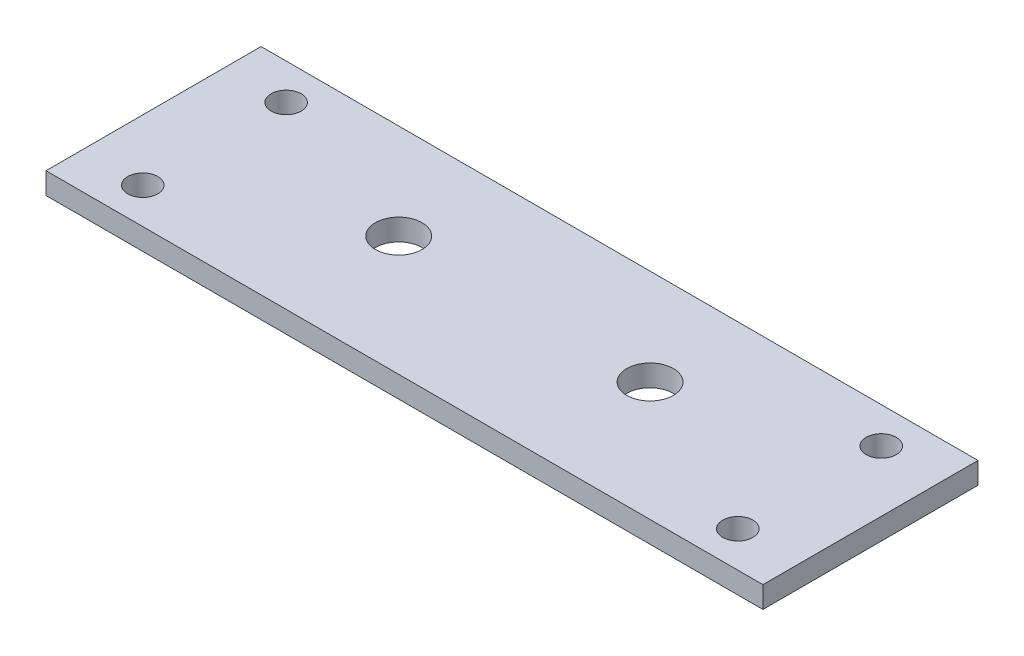
ISO-10303-21;
HEADER;
FILE_DESCRIPTION(('STEP AP214'),'2;1');
FILE_NAME('part.step','',(''),(''),'','','');
FILE_SCHEMA(('AUTOMOTIVE_DESIGN { 1 0 10303 214 1 1 1 1 }'));
ENDSEC;
DATA;
#1=APPLICATION_CONTEXT('core data for automotive mechanical design processes');
#2=APPLICATION_PROTOCOL_DEFINITION('international standard','automotive_design',2000,#1);
#3=PRODUCT_CONTEXT('',#1,'mechanical');
#4=PRODUCT('Part','Part','',(#3));
#5=PRODUCT_RELATED_PRODUCT_CATEGORY('part','',(#4));
#6=PRODUCT_DEFINITION_FORMATION('','',#4);
#7=PRODUCT_DEFINITION_CONTEXT('part definition',#1,'design');
#8=PRODUCT_DEFINITION('design','',#6,#7);
#9=PRODUCT_DEFINITION_SHAPE('','',#8);
#10=(LENGTH_UNIT() NAMED_UNIT(*) SI_UNIT(.MILLI.,.METRE.));
#11=(NAMED_UNIT(*) PLANE_ANGLE_UNIT() SI_UNIT($,.RADIAN.));
#12=(NAMED_UNIT(*) SI_UNIT($,.STERADIAN.) SOLID_ANGLE_UNIT());
#13=UNCERTAINTY_MEASURE_WITH_UNIT(LENGTH_MEASURE(1.E-05),#10,'distance_accuracy_value','');
#14=(GEOMETRIC_REPRESENTATION_CONTEXT(3) GLOBAL_UNCERTAINTY_ASSIGNED_CONTEXT((#13)) GLOBAL_UNIT_ASSIGNED_CONTEXT((#10,
#11,#12)) REPRESENTATION_CONTEXT('',''));
#15=CARTESIAN_POINT('',(0.,0.,0.));
#16=DIRECTION('',(0.,0.,1.));
#17=DIRECTION('',(1.,0.,0.));
#18=AXIS2_PLACEMENT_3D('',#15,#16,#17);
#19=CARTESIAN_POINT('',(0.,3.,0.));
#20=DIRECTION('',(0.,1.,0.));
#21=DIRECTION('',(0.,0.,1.));
#22=AXIS2_PLACEMENT_3D('',#19,#20,#21);
#23=PLANE('',#22);
#24=CARTESIAN_POINT('',(-8.29073314424005,3.,-0.0903133903133735));
#25=DIRECTION('',(0.,1.,0.));
#26=DIRECTION('',(0.,0.,1.));
#27=AXIS2_PLACEMENT_3D('',#24,#25,#26);
#28=CIRCLE('',#27,3.25);
#29=CARTESIAN_POINT('',(-8.29073314424005,3.,3.15968660968663));
#30=VERTEX_POINT('',#29);
#31=EDGE_CURVE('E133',#30,#30,#28,.T.);
#32=ORIENTED_EDGE('',*,*,#31,.F.);
#33=EDGE_LOOP('',(#32));
#34=FACE_BOUND('',#33,.T.);
#35=CARTESIAN_POINT('',(-32.2907331442401,3.,-8.39031339031338));
#36=DIRECTION('',(0.,1.,0.));
#37=DIRECTION('',(0.,0.,-1.));
#38=AXIS2_PLACEMENT_3D('',#35,#36,#37);
#39=CIRCLE('',#38,2.1);
#40=CARTESIAN_POINT('',(-32.2907331442401,3.,-10.4903133903134));
#41=VERTEX_POINT('',#40);
#42=EDGE_CURVE('E121',#41,#41,#39,.T.);
#43=ORIENTED_EDGE('',*,*,#42,.F.);
#44=EDGE_LOOP('',(#43));
#45=FACE_BOUND('',#44,.T.);
#46=CARTESIAN_POINT('',(50.7092668557599,3.,-8.39031339031339));
#47=DIRECTION('',(0.,1.,0.));
#48=DIRECTION('',(0.,0.,1.));
#49=AXIS2_PLACEMENT_3D('',#46,#47,#48);
#50=CIRCLE('',#49,2.1);
#51=CARTESIAN_POINT('',(50.7092668557599,3.,-6.2903133903134));
#52=VERTEX_POINT('',#51);
#53=EDGE_CURVE('E100',#52,#52,#50,.T.);
#54=ORIENTED_EDGE('',*,*,#53,.F.);
#55=EDGE_LOOP('',(#54));
#56=FACE_BOUND('',#55,.T.);
#57=DIRECTION('',(0.,0.,1.));
#58=VECTOR('',#57,1.);
#59=CARTESIAN_POINT('',(-40.7907331442401,3.,-13.3903133903134));
#60=LINE('',#59,#58);
#61=CARTESIAN_POINT('',(-40.7907331442401,3.,-13.3903133903134));
#62=VERTEX_POINT('',#61);
#63=CARTESIAN_POINT('',(-40.7907331442401,3.,16.6096866096866));
#64=VERTEX_POINT('',#63);
#65=EDGE_CURVE('E85',#62,#64,#60,.T.);
#66=ORIENTED_EDGE('',*,*,#65,.T.);
#67=DIRECTION('',(1.,0.,0.));
#68=VECTOR('',#67,1.);
#69=CARTESIAN_POINT('',(-40.7907331442401,3.,16.6096866096866));
#70=LINE('',#69,#68);
#71=CARTESIAN_POINT('',(59.2092668557599,3.,16.6096866096866));
#72=VERTEX_POINT('',#71);
#73=EDGE_CURVE('E80',#64,#72,#70,.T.);
#74=ORIENTED_EDGE('',*,*,#73,.T.);
#75=DIRECTION('',(0.,0.,-1.));
#76=VECTOR('',#75,1.);
#77=CARTESIAN_POINT('',(59.2092668557599,3.,-13.3903133903134));
#78=LINE('',#77,#76);
#79=CARTESIAN_POINT('',(59.2092668557599,3.,-13.3903133903134));
#80=VERTEX_POINT('',#79);
#81=EDGE_CURVE('E83',#72,#80,#78,.T.);
#82=ORIENTED_EDGE('',*,*,#81,.T.);
#83=DIRECTION('',(-1.,0.,0.));
#84=VECTOR('',#83,1.);
#85=CARTESIAN_POINT('',(-40.7907331442401,3.,-13.3903133903134));
#86=LINE('',#85,#84);
#87=EDGE_CURVE('E50',#80,#62,#86,.T.);
#88=ORIENTED_EDGE('',*,*,#87,.T.);
#89=EDGE_LOOP('',(#66,#74,#82,#88));
#90=FACE_BOUND('',#89,.T.);
#91=CARTESIAN_POINT('',(50.7092668557599,3.,11.6096866096866));
#92=DIRECTION('',(0.,1.,0.));
#93=DIRECTION('',(0.,0.,-1.));
#94=AXIS2_PLACEMENT_3D('',#91,#92,#93);
#95=CIRCLE('',#94,2.1);
#96=CARTESIAN_POINT('',(50.7092668557599,3.,9.50968660968662));
#97=VERTEX_POINT('',#96);
#98=EDGE_CURVE('E115',#97,#97,#95,.T.);
#99=ORIENTED_EDGE('',*,*,#98,.F.);
#100=EDGE_LOOP('',(#99));
#101=FACE_BOUND('',#100,.T.);
#102=CARTESIAN_POINT('',(-32.2907331442401,3.,11.6096866096866));
#103=DIRECTION('',(0.,1.,0.));
#104=DIRECTION('',(0.,0.,1.));
#105=AXIS2_PLACEMENT_3D('',#102,#103,#104);
#106=CIRCLE('',#105,2.1);
#107=CARTESIAN_POINT('',(-32.2907331442401,3.,13.7096866096866));
#108=VERTEX_POINT('',#107);
#109=EDGE_CURVE('E127',#108,#108,#106,.T.);
#110=ORIENTED_EDGE('',*,*,#109,.F.);
#111=EDGE_LOOP('',(#110));
#112=FACE_BOUND('',#111,.T.);
#113=CARTESIAN_POINT('',(26.8596216741862,3.,0.));
#114=DIRECTION('',(0.,1.,0.));
#115=DIRECTION('',(0.,0.,1.));
#116=AXIS2_PLACEMENT_3D('',#113,#114,#115);
#117=CIRCLE('',#116,3.25);
#118=CARTESIAN_POINT('',(26.8596216741862,3.,3.25));
#119=VERTEX_POINT('',#118);
#120=EDGE_CURVE('E139',#119,#119,#117,.T.);
#121=ORIENTED_EDGE('',*,*,#120,.F.);
#122=EDGE_LOOP('',(#121));
#123=FACE_BOUND('',#122,.T.);
#124=ADVANCED_FACE('F33',(#34,#45,#56,#90,#101,#112,#123),#23,.T.);
#125=CARTESIAN_POINT('',(0.,0.,0.));
#126=DIRECTION('',(0.,1.,0.));
#127=DIRECTION('',(0.,0.,1.));
#128=AXIS2_PLACEMENT_3D('',#125,#126,#127);
#129=PLANE('',#128);
#130=DIRECTION('',(0.,0.,1.));
#131=VECTOR('',#130,1.);
#132=CARTESIAN_POINT('',(-40.7907331442401,0.,-13.3903133903134));
#133=LINE('',#132,#131);
#134=CARTESIAN_POINT('',(-40.7907331442401,0.,-13.3903133903134));
#135=VERTEX_POINT('',#134);
#136=CARTESIAN_POINT('',(-40.7907331442401,0.,16.6096866096866));
#137=VERTEX_POINT('',#136);
#138=EDGE_CURVE('E97',#135,#137,#133,.T.);
#139=ORIENTED_EDGE('',*,*,#138,.F.);
#140=DIRECTION('',(-1.,0.,0.));
#141=VECTOR('',#140,1.);
#142=CARTESIAN_POINT('',(-40.7907331442401,0.,-13.3903133903134));
#143=LINE('',#142,#141);
#144=CARTESIAN_POINT('',(59.2092668557599,0.,-13.3903133903134));
#145=VERTEX_POINT('',#144);
#146=EDGE_CURVE('E73',#145,#135,#143,.T.);
#147=ORIENTED_EDGE('',*,*,#146,.F.);
#148=DIRECTION('',(0.,0.,-1.));
#149=VECTOR('',#148,1.);
#150=CARTESIAN_POINT('',(59.2092668557599,0.,-13.3903133903134));
#151=LINE('',#150,#149);
#152=CARTESIAN_POINT('',(59.2092668557599,0.,16.6096866096866));
#153=VERTEX_POINT('',#152);
#154=EDGE_CURVE('E67',#153,#145,#151,.T.);
#155=ORIENTED_EDGE('',*,*,#154,.F.);
#156=DIRECTION('',(1.,0.,0.));
#157=VECTOR('',#156,1.);
#158=CARTESIAN_POINT('',(-40.7907331442401,0.,16.6096866096866));
#159=LINE('',#158,#157);
#160=EDGE_CURVE('E89',#137,#153,#159,.T.);
#161=ORIENTED_EDGE('',*,*,#160,.F.);
#162=EDGE_LOOP('',(#139,#147,#155,#161));
#163=FACE_BOUND('',#162,.T.);
#164=CARTESIAN_POINT('',(50.7092668557599,0.,-8.39031339031339));
#165=DIRECTION('',(0.,1.,0.));
#166=DIRECTION('',(0.,0.,1.));
#167=AXIS2_PLACEMENT_3D('',#164,#165,#166);
#168=CIRCLE('',#167,2.1);
#169=CARTESIAN_POINT('',(50.7092668557599,0.,-6.2903133903134));
#170=VERTEX_POINT('',#169);
#171=EDGE_CURVE('E112',#170,#170,#168,.T.);
#172=ORIENTED_EDGE('',*,*,#171,.T.);
#173=EDGE_LOOP('',(#172));
#174=FACE_BOUND('',#173,.T.);
#175=CARTESIAN_POINT('',(50.7092668557599,0.,11.6096866096866));
#176=DIRECTION('',(0.,1.,0.));
#177=DIRECTION('',(0.,0.,-1.));
#178=AXIS2_PLACEMENT_3D('',#175,#176,#177);
#179=CIRCLE('',#178,2.1);
#180=CARTESIAN_POINT('',(50.7092668557599,0.,9.50968660968662));
#181=VERTEX_POINT('',#180);
#182=EDGE_CURVE('E118',#181,#181,#179,.T.);
#183=ORIENTED_EDGE('',*,*,#182,.T.);
#184=EDGE_LOOP('',(#183));
#185=FACE_BOUND('',#184,.T.);
#186=CARTESIAN_POINT('',(-32.2907331442401,0.,-8.39031339031338));
#187=DIRECTION('',(0.,1.,0.));
#188=DIRECTION('',(0.,0.,-1.));
#189=AXIS2_PLACEMENT_3D('',#186,#187,#188);
#190=CIRCLE('',#189,2.1);
#191=CARTESIAN_POINT('',(-32.2907331442401,0.,-10.4903133903134));
#192=VERTEX_POINT('',#191);
#193=EDGE_CURVE('E124',#192,#192,#190,.T.);
#194=ORIENTED_EDGE('',*,*,#193,.T.);
#195=EDGE_LOOP('',(#194));
#196=FACE_BOUND('',#195,.T.);
#197=CARTESIAN_POINT('',(-32.2907331442401,0.,11.6096866096866));
#198=DIRECTION('',(0.,1.,0.));
#199=DIRECTION('',(0.,0.,1.));
#200=AXIS2_PLACEMENT_3D('',#197,#198,#199);
#201=CIRCLE('',#200,2.1);
#202=CARTESIAN_POINT('',(-32.2907331442401,0.,13.7096866096866));
#203=VERTEX_POINT('',#202);
#204=EDGE_CURVE('E130',#203,#203,#201,.T.);
#205=ORIENTED_EDGE('',*,*,#204,.T.);
#206=EDGE_LOOP('',(#205));
#207=FACE_BOUND('',#206,.T.);
#208=CARTESIAN_POINT('',(-8.29073314424005,0.,-0.0903133903133735));
#209=DIRECTION('',(0.,1.,0.));
#210=DIRECTION('',(0.,0.,1.));
#211=AXIS2_PLACEMENT_3D('',#208,#209,#210);
#212=CIRCLE('',#211,3.25);
#213=CARTESIAN_POINT('',(-8.29073314424005,0.,3.15968660968663));
#214=VERTEX_POINT('',#213);
#215=EDGE_CURVE('E136',#214,#214,#212,.T.);
#216=ORIENTED_EDGE('',*,*,#215,.T.);
#217=EDGE_LOOP('',(#216));
#218=FACE_BOUND('',#217,.T.);
#219=CARTESIAN_POINT('',(26.8596216741862,0.,0.));
#220=DIRECTION('',(0.,1.,0.));
#221=DIRECTION('',(0.,0.,1.));
#222=AXIS2_PLACEMENT_3D('',#219,#220,#221);
#223=CIRCLE('',#222,3.25);
#224=CARTESIAN_POINT('',(26.8596216741862,0.,3.25));
#225=VERTEX_POINT('',#224);
#226=EDGE_CURVE('E142',#225,#225,#223,.T.);
#227=ORIENTED_EDGE('',*,*,#226,.T.);
#228=EDGE_LOOP('',(#227));
#229=FACE_BOUND('',#228,.T.);
#230=ADVANCED_FACE('F108',(#163,#174,#185,#196,#207,#218,#229),#129,.F.);
#231=CARTESIAN_POINT('',(-40.7907331442401,3.,-13.3903133903134));
#232=DIRECTION('',(1.,0.,0.));
#233=DIRECTION('',(0.,0.,-1.));
#234=AXIS2_PLACEMENT_3D('',#231,#232,#233);
#235=PLANE('',#234);
#236=ORIENTED_EDGE('',*,*,#138,.T.);
#237=DIRECTION('',(0.,-1.,0.));
#238=VECTOR('',#237,1.);
#239=CARTESIAN_POINT('',(-40.7907331442401,3.,16.6096866096866));
#240=LINE('',#239,#238);
#241=EDGE_CURVE('E11',#64,#137,#240,.T.);
#242=ORIENTED_EDGE('',*,*,#241,.F.);
#243=ORIENTED_EDGE('',*,*,#65,.F.);
#244=DIRECTION('',(0.,-1.,0.));
#245=VECTOR('',#244,1.);
#246=CARTESIAN_POINT('',(-40.7907331442401,3.,-13.3903133903134));
#247=LINE('',#246,#245);
#248=EDGE_CURVE('E93',#62,#135,#247,.T.);
#249=ORIENTED_EDGE('',*,*,#248,.T.);
#250=EDGE_LOOP('',(#236,#242,#243,#249));
#251=FACE_BOUND('',#250,.T.);
#252=ADVANCED_FACE('F35',(#251),#235,.F.);
#253=CARTESIAN_POINT('',(-40.7907331442401,3.,16.6096866096866));
#254=DIRECTION('',(0.,0.,-1.));
#255=DIRECTION('',(-1.,0.,0.));
#256=AXIS2_PLACEMENT_3D('',#253,#254,#255);
#257=PLANE('',#256);
#258=ORIENTED_EDGE('',*,*,#160,.T.);
#259=DIRECTION('',(0.,-1.,0.));
#260=VECTOR('',#259,1.);
#261=CARTESIAN_POINT('',(59.2092668557599,3.,16.6096866096866));
#262=LINE('',#261,#260);
#263=EDGE_CURVE('E42',#72,#153,#262,.T.);
#264=ORIENTED_EDGE('',*,*,#263,.F.);
#265=ORIENTED_EDGE('',*,*,#73,.F.);
#266=ORIENTED_EDGE('',*,*,#241,.T.);
#267=EDGE_LOOP('',(#258,#264,#265,#266));
#268=FACE_BOUND('',#267,.T.);
#269=ADVANCED_FACE('F88',(#268),#257,.F.);
#270=CARTESIAN_POINT('',(59.2092668557599,3.,-13.3903133903134));
#271=DIRECTION('',(-1.,0.,0.));
#272=DIRECTION('',(0.,0.,1.));
#273=AXIS2_PLACEMENT_3D('',#270,#271,#272);
#274=PLANE('',#273);
#275=ORIENTED_EDGE('',*,*,#154,.T.);
#276=DIRECTION('',(0.,-1.,0.));
#277=VECTOR('',#276,1.);
#278=CARTESIAN_POINT('',(59.2092668557599,3.,-13.3903133903134));
#279=LINE('',#278,#277);
#280=EDGE_CURVE('E90',#80,#145,#279,.T.);
#281=ORIENTED_EDGE('',*,*,#280,.F.);
#282=ORIENTED_EDGE('',*,*,#81,.F.);
#283=ORIENTED_EDGE('',*,*,#263,.T.);
#284=EDGE_LOOP('',(#275,#281,#282,#283));
#285=FACE_BOUND('',#284,.T.);
#286=ADVANCED_FACE('F91',(#285),#274,.F.);
#287=CARTESIAN_POINT('',(-40.7907331442401,3.,-13.3903133903134));
#288=DIRECTION('',(0.,0.,1.));
#289=DIRECTION('',(1.,0.,0.));
#290=AXIS2_PLACEMENT_3D('',#287,#288,#289);
#291=PLANE('',#290);
#292=ORIENTED_EDGE('',*,*,#146,.T.);
#293=ORIENTED_EDGE('',*,*,#248,.F.);
#294=ORIENTED_EDGE('',*,*,#87,.F.);
#295=ORIENTED_EDGE('',*,*,#280,.T.);
#296=EDGE_LOOP('',(#292,#293,#294,#295));
#297=FACE_BOUND('',#296,.T.);
#298=ADVANCED_FACE('F105',(#297),#291,.F.);
#299=CARTESIAN_POINT('',(50.7092668557599,3.,-8.39031339031339));
#300=DIRECTION('',(0.,-1.,0.));
#301=DIRECTION('',(0.,0.,-1.));
#302=AXIS2_PLACEMENT_3D('',#299,#300,#301);
#303=CYLINDRICAL_SURFACE('',#302,2.1);
#304=ORIENTED_EDGE('',*,*,#53,.T.);
#305=EDGE_LOOP('',(#304));
#306=FACE_BOUND('',#305,.T.);
#307=ORIENTED_EDGE('',*,*,#171,.F.);
#308=EDGE_LOOP('',(#307));
#309=FACE_BOUND('',#308,.T.);
#310=ADVANCED_FACE('F161',(#306,#309),#303,.F.);
#311=CARTESIAN_POINT('',(50.7092668557599,3.,11.6096866096866));
#312=DIRECTION('',(0.,-1.,0.));
#313=DIRECTION('',(0.,0.,-1.));
#314=AXIS2_PLACEMENT_3D('',#311,#312,#313);
#315=CYLINDRICAL_SURFACE('',#314,2.1);
#316=ORIENTED_EDGE('',*,*,#98,.T.);
#317=EDGE_LOOP('',(#316));
#318=FACE_BOUND('',#317,.T.);
#319=ORIENTED_EDGE('',*,*,#182,.F.);
#320=EDGE_LOOP('',(#319));
#321=FACE_BOUND('',#320,.T.);
#322=ADVANCED_FACE('F207',(#318,#321),#315,.F.);
#323=CARTESIAN_POINT('',(-32.2907331442401,3.,-8.39031339031338));
#324=DIRECTION('',(0.,-1.,0.));
#325=DIRECTION('',(0.,0.,-1.));
#326=AXIS2_PLACEMENT_3D('',#323,#324,#325);
#327=CYLINDRICAL_SURFACE('',#326,2.1);
#328=ORIENTED_EDGE('',*,*,#42,.T.);
#329=EDGE_LOOP('',(#328));
#330=FACE_BOUND('',#329,.T.);
#331=ORIENTED_EDGE('',*,*,#193,.F.);
#332=EDGE_LOOP('',(#331));
#333=FACE_BOUND('',#332,.T.);
#334=ADVANCED_FACE('F215',(#330,#333),#327,.F.);
#335=CARTESIAN_POINT('',(-32.2907331442401,3.,11.6096866096866));
#336=DIRECTION('',(0.,-1.,0.));
#337=DIRECTION('',(0.,0.,-1.));
#338=AXIS2_PLACEMENT_3D('',#335,#336,#337);
#339=CYLINDRICAL_SURFACE('',#338,2.1);
#340=ORIENTED_EDGE('',*,*,#109,.T.);
#341=EDGE_LOOP('',(#340));
#342=FACE_BOUND('',#341,.T.);
#343=ORIENTED_EDGE('',*,*,#204,.F.);
#344=EDGE_LOOP('',(#343));
#345=FACE_BOUND('',#344,.T.);
#346=ADVANCED_FACE('F223',(#342,#345),#339,.F.);
#347=CARTESIAN_POINT('',(-8.29073314424005,3.,-0.0903133903133735));
#348=DIRECTION('',(0.,-1.,0.));
#349=DIRECTION('',(0.,0.,-1.));
#350=AXIS2_PLACEMENT_3D('',#347,#348,#349);
#351=CYLINDRICAL_SURFACE('',#350,3.25);
#352=ORIENTED_EDGE('',*,*,#31,.T.);
#353=EDGE_LOOP('',(#352));
#354=FACE_BOUND('',#353,.T.);
#355=ORIENTED_EDGE('',*,*,#215,.F.);
#356=EDGE_LOOP('',(#355));
#357=FACE_BOUND('',#356,.T.);
#358=ADVANCED_FACE('F232',(#354,#357),#351,.F.);
#359=CARTESIAN_POINT('',(26.8596216741862,3.,0.));
#360=DIRECTION('',(0.,-1.,0.));
#361=DIRECTION('',(0.,0.,-1.));
#362=AXIS2_PLACEMENT_3D('',#359,#360,#361);
#363=CYLINDRICAL_SURFACE('',#362,3.25);
#364=ORIENTED_EDGE('',*,*,#120,.T.);
#365=EDGE_LOOP('',(#364));
#366=FACE_BOUND('',#365,.T.);
#367=ORIENTED_EDGE('',*,*,#226,.F.);
#368=EDGE_LOOP('',(#367));
#369=FACE_BOUND('',#368,.T.);
#370=ADVANCED_FACE('F148',(#366,#369),#363,.F.);
#371=CLOSED_SHELL('',(#124,#230,#252,#269,#286,#298,#310,#322,#334,#346,#358,#370));
#372=MANIFOLD_SOLID_BREP('B2',#371);
#373=ADVANCED_BREP_SHAPE_REPRESENTATION('',(#18,#372),#14);
#374=SHAPE_DEFINITION_REPRESENTATION(#9,#373);
ENDSEC;
END-ISO-10303-21;
